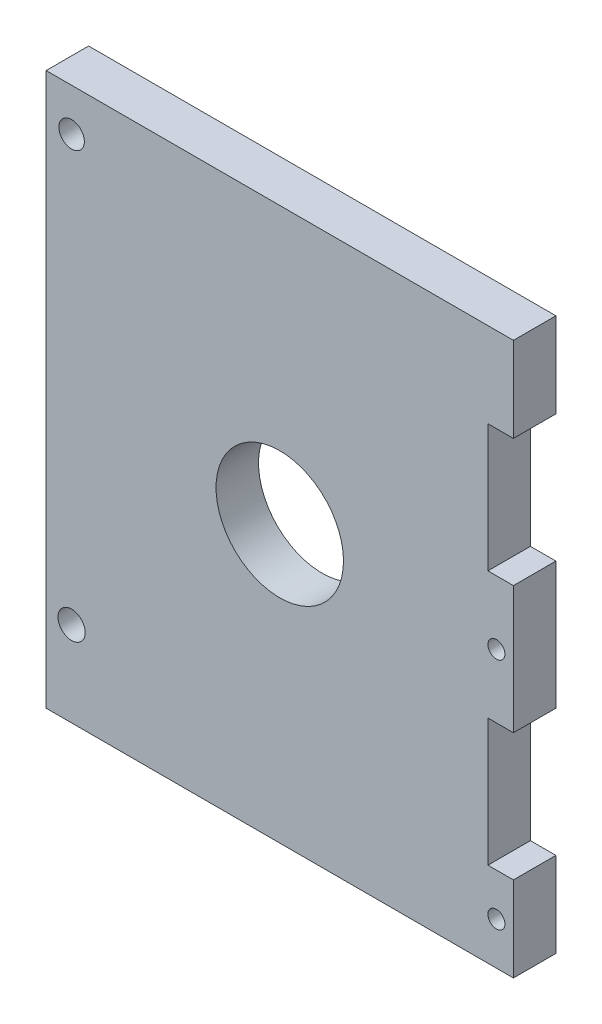
ISO-10303-21;
HEADER;
FILE_DESCRIPTION(('STEP AP214'),'2;1');
FILE_NAME('part.step','',(''),(''),'','','');
FILE_SCHEMA(('AUTOMOTIVE_DESIGN { 1 0 10303 214 1 1 1 1 }'));
ENDSEC;
DATA;
#1=APPLICATION_CONTEXT('core data for automotive mechanical design processes');
#2=APPLICATION_PROTOCOL_DEFINITION('international standard','automotive_design',2000,#1);
#3=PRODUCT_CONTEXT('',#1,'mechanical');
#4=PRODUCT('Part','Part','',(#3));
#5=PRODUCT_RELATED_PRODUCT_CATEGORY('part','',(#4));
#6=PRODUCT_DEFINITION_FORMATION('','',#4);
#7=PRODUCT_DEFINITION_CONTEXT('part definition',#1,'design');
#8=PRODUCT_DEFINITION('design','',#6,#7);
#9=PRODUCT_DEFINITION_SHAPE('','',#8);
#10=(LENGTH_UNIT() NAMED_UNIT(*) SI_UNIT(.MILLI.,.METRE.));
#11=(NAMED_UNIT(*) PLANE_ANGLE_UNIT() SI_UNIT($,.RADIAN.));
#12=(NAMED_UNIT(*) SI_UNIT($,.STERADIAN.) SOLID_ANGLE_UNIT());
#13=UNCERTAINTY_MEASURE_WITH_UNIT(LENGTH_MEASURE(1.E-05),#10,'distance_accuracy_value','');
#14=(GEOMETRIC_REPRESENTATION_CONTEXT(3) GLOBAL_UNCERTAINTY_ASSIGNED_CONTEXT((#13)) GLOBAL_UNIT_ASSIGNED_CONTEXT((#10,
#11,#12)) REPRESENTATION_CONTEXT('',''));
#15=CARTESIAN_POINT('',(0.,0.,0.));
#16=DIRECTION('',(0.,0.,1.));
#17=DIRECTION('',(1.,0.,0.));
#18=AXIS2_PLACEMENT_3D('',#15,#16,#17);
#19=CARTESIAN_POINT('',(55.,0.,5.));
#20=DIRECTION('',(-1.,0.,0.));
#21=DIRECTION('',(0.,0.,1.));
#22=AXIS2_PLACEMENT_3D('',#19,#20,#21);
#23=PLANE('',#22);
#24=DIRECTION('',(0.,1.,0.));
#25=VECTOR('',#24,1.);
#26=CARTESIAN_POINT('',(55.,0.,0.));
#27=LINE('',#26,#25);
#28=CARTESIAN_POINT('',(55.,25.,0.));
#29=VERTEX_POINT('',#28);
#30=CARTESIAN_POINT('',(55.,40.,0.));
#31=VERTEX_POINT('',#30);
#32=EDGE_CURVE('E167',#29,#31,#27,.T.);
#33=ORIENTED_EDGE('',*,*,#32,.T.);
#34=DIRECTION('',(0.,0.,1.));
#35=VECTOR('',#34,1.);
#36=CARTESIAN_POINT('',(55.,40.,0.));
#37=LINE('',#36,#35);
#38=CARTESIAN_POINT('',(55.,40.,5.));
#39=VERTEX_POINT('',#38);
#40=EDGE_CURVE('E252',#31,#39,#37,.T.);
#41=ORIENTED_EDGE('',*,*,#40,.T.);
#42=DIRECTION('',(0.,1.,0.));
#43=VECTOR('',#42,1.);
#44=CARTESIAN_POINT('',(55.,0.,5.));
#45=LINE('',#44,#43);
#46=CARTESIAN_POINT('',(55.,25.,5.));
#47=VERTEX_POINT('',#46);
#48=EDGE_CURVE('E247',#47,#39,#45,.T.);
#49=ORIENTED_EDGE('',*,*,#48,.F.);
#50=DIRECTION('',(0.,0.,1.));
#51=VECTOR('',#50,1.);
#52=CARTESIAN_POINT('',(55.,25.,0.));
#53=LINE('',#52,#51);
#54=EDGE_CURVE('E212',#29,#47,#53,.T.);
#55=ORIENTED_EDGE('',*,*,#54,.F.);
#56=EDGE_LOOP('',(#33,#41,#49,#55));
#57=FACE_BOUND('',#56,.T.);
#58=ADVANCED_FACE('F50',(#57),#23,.F.);
#59=CARTESIAN_POINT('',(55.,0.,0.));
#60=VERTEX_POINT('',#59);
#61=CARTESIAN_POINT('',(55.,10.,0.));
#62=VERTEX_POINT('',#61);
#63=EDGE_CURVE('E170',#60,#62,#27,.T.);
#64=ORIENTED_EDGE('',*,*,#63,.T.);
#65=DIRECTION('',(0.,0.,1.));
#66=VECTOR('',#65,1.);
#67=CARTESIAN_POINT('',(55.,10.,0.));
#68=LINE('',#67,#66);
#69=CARTESIAN_POINT('',(55.,10.,5.));
#70=VERTEX_POINT('',#69);
#71=EDGE_CURVE('E234',#62,#70,#68,.T.);
#72=ORIENTED_EDGE('',*,*,#71,.T.);
#73=CARTESIAN_POINT('',(55.,0.,5.));
#74=VERTEX_POINT('',#73);
#75=EDGE_CURVE('E204',#74,#70,#45,.T.);
#76=ORIENTED_EDGE('',*,*,#75,.F.);
#77=DIRECTION('',(0.,0.,-1.));
#78=VECTOR('',#77,1.);
#79=CARTESIAN_POINT('',(55.,0.,5.));
#80=LINE('',#79,#78);
#81=EDGE_CURVE('E59',#74,#60,#80,.T.);
#82=ORIENTED_EDGE('',*,*,#81,.T.);
#83=EDGE_LOOP('',(#64,#72,#76,#82));
#84=FACE_BOUND('',#83,.T.);
#85=ADVANCED_FACE('F202',(#84),#23,.F.);
#86=CARTESIAN_POINT('',(0.,0.,5.));
#87=DIRECTION('',(1.,0.,0.));
#88=DIRECTION('',(0.,0.,-1.));
#89=AXIS2_PLACEMENT_3D('',#86,#87,#88);
#90=PLANE('',#89);
#91=DIRECTION('',(0.,-1.,0.));
#92=VECTOR('',#91,1.);
#93=CARTESIAN_POINT('',(0.,0.,0.));
#94=LINE('',#93,#92);
#95=CARTESIAN_POINT('',(0.,65.,0.));
#96=VERTEX_POINT('',#95);
#97=CARTESIAN_POINT('',(0.,0.,0.));
#98=VERTEX_POINT('',#97);
#99=EDGE_CURVE('E174',#96,#98,#94,.T.);
#100=ORIENTED_EDGE('',*,*,#99,.T.);
#101=DIRECTION('',(0.,0.,-1.));
#102=VECTOR('',#101,1.);
#103=CARTESIAN_POINT('',(0.,0.,5.));
#104=LINE('',#103,#102);
#105=CARTESIAN_POINT('',(0.,0.,5.));
#106=VERTEX_POINT('',#105);
#107=EDGE_CURVE('E13',#106,#98,#104,.T.);
#108=ORIENTED_EDGE('',*,*,#107,.F.);
#109=DIRECTION('',(0.,-1.,0.));
#110=VECTOR('',#109,1.);
#111=CARTESIAN_POINT('',(0.,0.,5.));
#112=LINE('',#111,#110);
#113=CARTESIAN_POINT('',(0.,65.,5.));
#114=VERTEX_POINT('',#113);
#115=EDGE_CURVE('E184',#114,#106,#112,.T.);
#116=ORIENTED_EDGE('',*,*,#115,.F.);
#117=DIRECTION('',(0.,0.,-1.));
#118=VECTOR('',#117,1.);
#119=CARTESIAN_POINT('',(0.,65.,5.));
#120=LINE('',#119,#118);
#121=EDGE_CURVE('E193',#114,#96,#120,.T.);
#122=ORIENTED_EDGE('',*,*,#121,.T.);
#123=EDGE_LOOP('',(#100,#108,#116,#122));
#124=FACE_BOUND('',#123,.T.);
#125=ADVANCED_FACE('F52',(#124),#90,.F.);
#126=CARTESIAN_POINT('',(0.,0.,5.));
#127=DIRECTION('',(0.,1.,0.));
#128=DIRECTION('',(0.,0.,1.));
#129=AXIS2_PLACEMENT_3D('',#126,#127,#128);
#130=PLANE('',#129);
#131=DIRECTION('',(1.,0.,0.));
#132=VECTOR('',#131,1.);
#133=CARTESIAN_POINT('',(0.,0.,0.));
#134=LINE('',#133,#132);
#135=EDGE_CURVE('E168',#98,#60,#134,.T.);
#136=ORIENTED_EDGE('',*,*,#135,.T.);
#137=ORIENTED_EDGE('',*,*,#81,.F.);
#138=DIRECTION('',(1.,0.,0.));
#139=VECTOR('',#138,1.);
#140=CARTESIAN_POINT('',(0.,0.,5.));
#141=LINE('',#140,#139);
#142=EDGE_CURVE('E190',#106,#74,#141,.T.);
#143=ORIENTED_EDGE('',*,*,#142,.F.);
#144=ORIENTED_EDGE('',*,*,#107,.T.);
#145=EDGE_LOOP('',(#136,#137,#143,#144));
#146=FACE_BOUND('',#145,.T.);
#147=ADVANCED_FACE('F284',(#146),#130,.F.);
#148=CARTESIAN_POINT('',(55.,55.,5.));
#149=VERTEX_POINT('',#148);
#150=CARTESIAN_POINT('',(55.,65.,5.));
#151=VERTEX_POINT('',#150);
#152=EDGE_CURVE('E157',#149,#151,#45,.T.);
#153=ORIENTED_EDGE('',*,*,#152,.F.);
#154=DIRECTION('',(0.,0.,1.));
#155=VECTOR('',#154,1.);
#156=CARTESIAN_POINT('',(55.,55.,0.));
#157=LINE('',#156,#155);
#158=CARTESIAN_POINT('',(55.,55.,0.));
#159=VERTEX_POINT('',#158);
#160=EDGE_CURVE('E143',#159,#149,#157,.T.);
#161=ORIENTED_EDGE('',*,*,#160,.F.);
#162=CARTESIAN_POINT('',(55.,65.,0.));
#163=VERTEX_POINT('',#162);
#164=EDGE_CURVE('E155',#159,#163,#27,.T.);
#165=ORIENTED_EDGE('',*,*,#164,.T.);
#166=DIRECTION('',(0.,0.,-1.));
#167=VECTOR('',#166,1.);
#168=CARTESIAN_POINT('',(55.,65.,5.));
#169=LINE('',#168,#167);
#170=EDGE_CURVE('E196',#151,#163,#169,.T.);
#171=ORIENTED_EDGE('',*,*,#170,.F.);
#172=EDGE_LOOP('',(#153,#161,#165,#171));
#173=FACE_BOUND('',#172,.T.);
#174=ADVANCED_FACE('F153',(#173),#23,.F.);
#175=CARTESIAN_POINT('',(0.,65.,5.));
#176=DIRECTION('',(0.,-1.,0.));
#177=DIRECTION('',(0.,0.,-1.));
#178=AXIS2_PLACEMENT_3D('',#175,#176,#177);
#179=PLANE('',#178);
#180=DIRECTION('',(-1.,0.,0.));
#181=VECTOR('',#180,1.);
#182=CARTESIAN_POINT('',(0.,65.,0.));
#183=LINE('',#182,#181);
#184=EDGE_CURVE('E165',#163,#96,#183,.T.);
#185=ORIENTED_EDGE('',*,*,#184,.T.);
#186=ORIENTED_EDGE('',*,*,#121,.F.);
#187=DIRECTION('',(-1.,0.,0.));
#188=VECTOR('',#187,1.);
#189=CARTESIAN_POINT('',(0.,65.,5.));
#190=LINE('',#189,#188);
#191=EDGE_CURVE('E197',#151,#114,#190,.T.);
#192=ORIENTED_EDGE('',*,*,#191,.F.);
#193=ORIENTED_EDGE('',*,*,#170,.T.);
#194=EDGE_LOOP('',(#185,#186,#192,#193));
#195=FACE_BOUND('',#194,.T.);
#196=ADVANCED_FACE('F281',(#195),#179,.F.);
#197=CARTESIAN_POINT('',(0.,0.,5.));
#198=DIRECTION('',(0.,0.,-1.));
#199=DIRECTION('',(-1.,0.,0.));
#200=AXIS2_PLACEMENT_3D('',#197,#198,#199);
#201=PLANE('',#200);
#202=CARTESIAN_POINT('',(53.,32.5,5.));
#203=DIRECTION('',(0.,0.,-1.));
#204=DIRECTION('',(-1.,0.,0.));
#205=AXIS2_PLACEMENT_3D('',#202,#203,#204);
#206=CIRCLE('',#205,0.999999999999998);
#207=CARTESIAN_POINT('',(52.,32.5,5.));
#208=VERTEX_POINT('',#207);
#209=EDGE_CURVE('E345',#208,#208,#206,.T.);
#210=ORIENTED_EDGE('',*,*,#209,.T.);
#211=EDGE_LOOP('',(#210));
#212=FACE_BOUND('',#211,.T.);
#213=CARTESIAN_POINT('',(53.,5.,5.));
#214=DIRECTION('',(0.,0.,-1.));
#215=DIRECTION('',(-1.,0.,0.));
#216=AXIS2_PLACEMENT_3D('',#213,#214,#215);
#217=CIRCLE('',#216,0.999999999999998);
#218=CARTESIAN_POINT('',(52.,5.,5.));
#219=VERTEX_POINT('',#218);
#220=EDGE_CURVE('E350',#219,#219,#217,.T.);
#221=ORIENTED_EDGE('',*,*,#220,.T.);
#222=EDGE_LOOP('',(#221));
#223=FACE_BOUND('',#222,.T.);
#224=CARTESIAN_POINT('',(3.,60.,5.));
#225=DIRECTION('',(0.,0.,1.));
#226=DIRECTION('',(1.,0.,0.));
#227=AXIS2_PLACEMENT_3D('',#224,#225,#226);
#228=CIRCLE('',#227,1.5);
#229=CARTESIAN_POINT('',(4.5,60.,5.));
#230=VERTEX_POINT('',#229);
#231=EDGE_CURVE('E368',#230,#230,#228,.T.);
#232=ORIENTED_EDGE('',*,*,#231,.F.);
#233=EDGE_LOOP('',(#232));
#234=FACE_BOUND('',#233,.T.);
#235=CARTESIAN_POINT('',(3.,10.,5.));
#236=DIRECTION('',(0.,0.,1.));
#237=DIRECTION('',(1.,0.,0.));
#238=AXIS2_PLACEMENT_3D('',#235,#236,#237);
#239=CIRCLE('',#238,1.6);
#240=CARTESIAN_POINT('',(4.6,10.,5.));
#241=VERTEX_POINT('',#240);
#242=EDGE_CURVE('E354',#241,#241,#239,.T.);
#243=ORIENTED_EDGE('',*,*,#242,.F.);
#244=EDGE_LOOP('',(#243));
#245=FACE_BOUND('',#244,.T.);
#246=CARTESIAN_POINT('',(27.5,32.5,5.));
#247=DIRECTION('',(0.,0.,1.));
#248=DIRECTION('',(1.,0.,0.));
#249=AXIS2_PLACEMENT_3D('',#246,#247,#248);
#250=CIRCLE('',#249,7.5);
#251=CARTESIAN_POINT('',(35.,32.5,5.));
#252=VERTEX_POINT('',#251);
#253=EDGE_CURVE('E367',#252,#252,#250,.T.);
#254=ORIENTED_EDGE('',*,*,#253,.F.);
#255=EDGE_LOOP('',(#254));
#256=FACE_BOUND('',#255,.T.);
#257=ORIENTED_EDGE('',*,*,#48,.T.);
#258=DIRECTION('',(1.,0.,0.));
#259=VECTOR('',#258,1.);
#260=CARTESIAN_POINT('',(55.,40.,5.));
#261=LINE('',#260,#259);
#262=CARTESIAN_POINT('',(52.,40.,5.));
#263=VERTEX_POINT('',#262);
#264=EDGE_CURVE('E149',#263,#39,#261,.T.);
#265=ORIENTED_EDGE('',*,*,#264,.F.);
#266=DIRECTION('',(0.,-1.,0.));
#267=VECTOR('',#266,1.);
#268=CARTESIAN_POINT('',(52.,55.,5.));
#269=LINE('',#268,#267);
#270=CARTESIAN_POINT('',(52.,55.,5.));
#271=VERTEX_POINT('',#270);
#272=EDGE_CURVE('E390',#271,#263,#269,.T.);
#273=ORIENTED_EDGE('',*,*,#272,.F.);
#274=DIRECTION('',(-1.,0.,0.));
#275=VECTOR('',#274,1.);
#276=CARTESIAN_POINT('',(55.,55.,5.));
#277=LINE('',#276,#275);
#278=EDGE_CURVE('E237',#149,#271,#277,.T.);
#279=ORIENTED_EDGE('',*,*,#278,.F.);
#280=ORIENTED_EDGE('',*,*,#152,.T.);
#281=ORIENTED_EDGE('',*,*,#191,.T.);
#282=ORIENTED_EDGE('',*,*,#115,.T.);
#283=ORIENTED_EDGE('',*,*,#142,.T.);
#284=ORIENTED_EDGE('',*,*,#75,.T.);
#285=DIRECTION('',(1.,0.,0.));
#286=VECTOR('',#285,1.);
#287=CARTESIAN_POINT('',(55.,10.,5.));
#288=LINE('',#287,#286);
#289=CARTESIAN_POINT('',(52.,10.,5.));
#290=VERTEX_POINT('',#289);
#291=EDGE_CURVE('E231',#290,#70,#288,.T.);
#292=ORIENTED_EDGE('',*,*,#291,.F.);
#293=DIRECTION('',(0.,-1.,0.));
#294=VECTOR('',#293,1.);
#295=CARTESIAN_POINT('',(52.,25.,5.));
#296=LINE('',#295,#294);
#297=CARTESIAN_POINT('',(52.,25.,5.));
#298=VERTEX_POINT('',#297);
#299=EDGE_CURVE('E226',#298,#290,#296,.T.);
#300=ORIENTED_EDGE('',*,*,#299,.F.);
#301=DIRECTION('',(-1.,0.,0.));
#302=VECTOR('',#301,1.);
#303=CARTESIAN_POINT('',(55.,25.,5.));
#304=LINE('',#303,#302);
#305=EDGE_CURVE('E222',#47,#298,#304,.T.);
#306=ORIENTED_EDGE('',*,*,#305,.F.);
#307=EDGE_LOOP('',(#257,#265,#273,#279,#280,#281,#282,#283,#284,#292,#300,#306));
#308=FACE_BOUND('',#307,.T.);
#309=ADVANCED_FACE('F278',(#212,#223,#234,#245,#256,#308),#201,.F.);
#310=CARTESIAN_POINT('',(0.,0.,0.));
#311=DIRECTION('',(0.,0.,-1.));
#312=DIRECTION('',(-1.,0.,0.));
#313=AXIS2_PLACEMENT_3D('',#310,#311,#312);
#314=PLANE('',#313);
#315=CARTESIAN_POINT('',(53.,32.5,0.));
#316=DIRECTION('',(0.,0.,-1.));
#317=DIRECTION('',(-1.,0.,0.));
#318=AXIS2_PLACEMENT_3D('',#315,#316,#317);
#319=CIRCLE('',#318,0.999999999999998);
#320=CARTESIAN_POINT('',(52.,32.5,0.));
#321=VERTEX_POINT('',#320);
#322=EDGE_CURVE('E348',#321,#321,#319,.T.);
#323=ORIENTED_EDGE('',*,*,#322,.F.);
#324=EDGE_LOOP('',(#323));
#325=FACE_BOUND('',#324,.T.);
#326=CARTESIAN_POINT('',(53.,5.,0.));
#327=DIRECTION('',(0.,0.,-1.));
#328=DIRECTION('',(-1.,0.,0.));
#329=AXIS2_PLACEMENT_3D('',#326,#327,#328);
#330=CIRCLE('',#329,0.999999999999998);
#331=CARTESIAN_POINT('',(52.,5.,0.));
#332=VERTEX_POINT('',#331);
#333=EDGE_CURVE('E357',#332,#332,#330,.T.);
#334=ORIENTED_EDGE('',*,*,#333,.F.);
#335=EDGE_LOOP('',(#334));
#336=FACE_BOUND('',#335,.T.);
#337=CARTESIAN_POINT('',(3.,60.,0.));
#338=DIRECTION('',(0.,0.,1.));
#339=DIRECTION('',(1.,0.,0.));
#340=AXIS2_PLACEMENT_3D('',#337,#338,#339);
#341=CIRCLE('',#340,1.5);
#342=CARTESIAN_POINT('',(4.5,60.,0.));
#343=VERTEX_POINT('',#342);
#344=EDGE_CURVE('E363',#343,#343,#341,.T.);
#345=ORIENTED_EDGE('',*,*,#344,.T.);
#346=EDGE_LOOP('',(#345));
#347=FACE_BOUND('',#346,.T.);
#348=CARTESIAN_POINT('',(3.,10.,0.));
#349=DIRECTION('',(0.,0.,1.));
#350=DIRECTION('',(1.,0.,0.));
#351=AXIS2_PLACEMENT_3D('',#348,#349,#350);
#352=CIRCLE('',#351,1.6);
#353=CARTESIAN_POINT('',(4.6,10.,0.));
#354=VERTEX_POINT('',#353);
#355=EDGE_CURVE('E372',#354,#354,#352,.T.);
#356=ORIENTED_EDGE('',*,*,#355,.T.);
#357=EDGE_LOOP('',(#356));
#358=FACE_BOUND('',#357,.T.);
#359=CARTESIAN_POINT('',(27.5,32.5,0.));
#360=DIRECTION('',(0.,0.,1.));
#361=DIRECTION('',(1.,0.,0.));
#362=AXIS2_PLACEMENT_3D('',#359,#360,#361);
#363=CIRCLE('',#362,7.5);
#364=CARTESIAN_POINT('',(35.,32.5,0.));
#365=VERTEX_POINT('',#364);
#366=EDGE_CURVE('E227',#365,#365,#363,.T.);
#367=ORIENTED_EDGE('',*,*,#366,.T.);
#368=EDGE_LOOP('',(#367));
#369=FACE_BOUND('',#368,.T.);
#370=DIRECTION('',(1.,0.,0.));
#371=VECTOR('',#370,1.);
#372=CARTESIAN_POINT('',(55.,40.,0.));
#373=LINE('',#372,#371);
#374=CARTESIAN_POINT('',(52.,40.,0.));
#375=VERTEX_POINT('',#374);
#376=EDGE_CURVE('E159',#375,#31,#373,.T.);
#377=ORIENTED_EDGE('',*,*,#376,.T.);
#378=ORIENTED_EDGE('',*,*,#32,.F.);
#379=DIRECTION('',(-1.,0.,0.));
#380=VECTOR('',#379,1.);
#381=CARTESIAN_POINT('',(55.,25.,0.));
#382=LINE('',#381,#380);
#383=CARTESIAN_POINT('',(52.,25.,0.));
#384=VERTEX_POINT('',#383);
#385=EDGE_CURVE('E218',#29,#384,#382,.T.);
#386=ORIENTED_EDGE('',*,*,#385,.T.);
#387=DIRECTION('',(0.,-1.,0.));
#388=VECTOR('',#387,1.);
#389=CARTESIAN_POINT('',(52.,25.,0.));
#390=LINE('',#389,#388);
#391=CARTESIAN_POINT('',(52.,10.,0.));
#392=VERTEX_POINT('',#391);
#393=EDGE_CURVE('E74',#384,#392,#390,.T.);
#394=ORIENTED_EDGE('',*,*,#393,.T.);
#395=DIRECTION('',(1.,0.,0.));
#396=VECTOR('',#395,1.);
#397=CARTESIAN_POINT('',(55.,10.,0.));
#398=LINE('',#397,#396);
#399=EDGE_CURVE('E208',#392,#62,#398,.T.);
#400=ORIENTED_EDGE('',*,*,#399,.T.);
#401=ORIENTED_EDGE('',*,*,#63,.F.);
#402=ORIENTED_EDGE('',*,*,#135,.F.);
#403=ORIENTED_EDGE('',*,*,#99,.F.);
#404=ORIENTED_EDGE('',*,*,#184,.F.);
#405=ORIENTED_EDGE('',*,*,#164,.F.);
#406=DIRECTION('',(-1.,0.,0.));
#407=VECTOR('',#406,1.);
#408=CARTESIAN_POINT('',(55.,55.,0.));
#409=LINE('',#408,#407);
#410=CARTESIAN_POINT('',(52.,55.,0.));
#411=VERTEX_POINT('',#410);
#412=EDGE_CURVE('E139',#159,#411,#409,.T.);
#413=ORIENTED_EDGE('',*,*,#412,.T.);
#414=DIRECTION('',(0.,-1.,0.));
#415=VECTOR('',#414,1.);
#416=CARTESIAN_POINT('',(52.,55.,0.));
#417=LINE('',#416,#415);
#418=EDGE_CURVE('E66',#411,#375,#417,.T.);
#419=ORIENTED_EDGE('',*,*,#418,.T.);
#420=EDGE_LOOP('',(#377,#378,#386,#394,#400,#401,#402,#403,#404,#405,#413,#419));
#421=FACE_BOUND('',#420,.T.);
#422=ADVANCED_FACE('F163',(#325,#336,#347,#358,#369,#421),#314,.T.);
#423=CARTESIAN_POINT('',(55.,10.,0.));
#424=DIRECTION('',(0.,-1.,0.));
#425=DIRECTION('',(0.,0.,-1.));
#426=AXIS2_PLACEMENT_3D('',#423,#424,#425);
#427=PLANE('',#426);
#428=ORIENTED_EDGE('',*,*,#291,.T.);
#429=ORIENTED_EDGE('',*,*,#71,.F.);
#430=ORIENTED_EDGE('',*,*,#399,.F.);
#431=DIRECTION('',(0.,0.,1.));
#432=VECTOR('',#431,1.);
#433=CARTESIAN_POINT('',(52.,10.,0.));
#434=LINE('',#433,#432);
#435=EDGE_CURVE('E238',#392,#290,#434,.T.);
#436=ORIENTED_EDGE('',*,*,#435,.T.);
#437=EDGE_LOOP('',(#428,#429,#430,#436));
#438=FACE_BOUND('',#437,.T.);
#439=ADVANCED_FACE('F300',(#438),#427,.F.);
#440=CARTESIAN_POINT('',(52.,25.,0.));
#441=DIRECTION('',(-1.,0.,0.));
#442=DIRECTION('',(0.,0.,1.));
#443=AXIS2_PLACEMENT_3D('',#440,#441,#442);
#444=PLANE('',#443);
#445=ORIENTED_EDGE('',*,*,#299,.T.);
#446=ORIENTED_EDGE('',*,*,#435,.F.);
#447=ORIENTED_EDGE('',*,*,#393,.F.);
#448=DIRECTION('',(0.,0.,1.));
#449=VECTOR('',#448,1.);
#450=CARTESIAN_POINT('',(52.,25.,0.));
#451=LINE('',#450,#449);
#452=EDGE_CURVE('E216',#384,#298,#451,.T.);
#453=ORIENTED_EDGE('',*,*,#452,.T.);
#454=EDGE_LOOP('',(#445,#446,#447,#453));
#455=FACE_BOUND('',#454,.T.);
#456=ADVANCED_FACE('F308',(#455),#444,.F.);
#457=CARTESIAN_POINT('',(55.,25.,0.));
#458=DIRECTION('',(0.,1.,0.));
#459=DIRECTION('',(0.,0.,1.));
#460=AXIS2_PLACEMENT_3D('',#457,#458,#459);
#461=PLANE('',#460);
#462=ORIENTED_EDGE('',*,*,#305,.T.);
#463=ORIENTED_EDGE('',*,*,#452,.F.);
#464=ORIENTED_EDGE('',*,*,#385,.F.);
#465=ORIENTED_EDGE('',*,*,#54,.T.);
#466=EDGE_LOOP('',(#462,#463,#464,#465));
#467=FACE_BOUND('',#466,.T.);
#468=ADVANCED_FACE('F272',(#467),#461,.F.);
#469=CARTESIAN_POINT('',(55.,40.,0.));
#470=DIRECTION('',(0.,-1.,0.));
#471=DIRECTION('',(0.,0.,-1.));
#472=AXIS2_PLACEMENT_3D('',#469,#470,#471);
#473=PLANE('',#472);
#474=ORIENTED_EDGE('',*,*,#264,.T.);
#475=ORIENTED_EDGE('',*,*,#40,.F.);
#476=ORIENTED_EDGE('',*,*,#376,.F.);
#477=DIRECTION('',(0.,0.,1.));
#478=VECTOR('',#477,1.);
#479=CARTESIAN_POINT('',(52.,40.,0.));
#480=LINE('',#479,#478);
#481=EDGE_CURVE('E257',#375,#263,#480,.T.);
#482=ORIENTED_EDGE('',*,*,#481,.T.);
#483=EDGE_LOOP('',(#474,#475,#476,#482));
#484=FACE_BOUND('',#483,.T.);
#485=ADVANCED_FACE('F307',(#484),#473,.F.);
#486=CARTESIAN_POINT('',(52.,55.,0.));
#487=DIRECTION('',(-1.,0.,0.));
#488=DIRECTION('',(0.,0.,1.));
#489=AXIS2_PLACEMENT_3D('',#486,#487,#488);
#490=PLANE('',#489);
#491=ORIENTED_EDGE('',*,*,#272,.T.);
#492=ORIENTED_EDGE('',*,*,#481,.F.);
#493=ORIENTED_EDGE('',*,*,#418,.F.);
#494=DIRECTION('',(0.,0.,1.));
#495=VECTOR('',#494,1.);
#496=CARTESIAN_POINT('',(52.,55.,0.));
#497=LINE('',#496,#495);
#498=EDGE_CURVE('E145',#411,#271,#497,.T.);
#499=ORIENTED_EDGE('',*,*,#498,.T.);
#500=EDGE_LOOP('',(#491,#492,#493,#499));
#501=FACE_BOUND('',#500,.T.);
#502=ADVANCED_FACE('F316',(#501),#490,.F.);
#503=CARTESIAN_POINT('',(55.,55.,0.));
#504=DIRECTION('',(0.,1.,0.));
#505=DIRECTION('',(0.,0.,1.));
#506=AXIS2_PLACEMENT_3D('',#503,#504,#505);
#507=PLANE('',#506);
#508=ORIENTED_EDGE('',*,*,#278,.T.);
#509=ORIENTED_EDGE('',*,*,#498,.F.);
#510=ORIENTED_EDGE('',*,*,#412,.F.);
#511=ORIENTED_EDGE('',*,*,#160,.T.);
#512=EDGE_LOOP('',(#508,#509,#510,#511));
#513=FACE_BOUND('',#512,.T.);
#514=ADVANCED_FACE('F142',(#513),#507,.F.);
#515=CARTESIAN_POINT('',(27.5,32.5,0.));
#516=DIRECTION('',(0.,0.,1.));
#517=DIRECTION('',(1.,0.,0.));
#518=AXIS2_PLACEMENT_3D('',#515,#516,#517);
#519=CYLINDRICAL_SURFACE('',#518,7.5);
#520=ORIENTED_EDGE('',*,*,#366,.F.);
#521=EDGE_LOOP('',(#520));
#522=FACE_BOUND('',#521,.T.);
#523=ORIENTED_EDGE('',*,*,#253,.T.);
#524=EDGE_LOOP('',(#523));
#525=FACE_BOUND('',#524,.T.);
#526=ADVANCED_FACE('F315',(#522,#525),#519,.F.);
#527=CARTESIAN_POINT('',(3.,10.,0.));
#528=DIRECTION('',(0.,0.,1.));
#529=DIRECTION('',(1.,0.,0.));
#530=AXIS2_PLACEMENT_3D('',#527,#528,#529);
#531=CYLINDRICAL_SURFACE('',#530,1.6);
#532=ORIENTED_EDGE('',*,*,#355,.F.);
#533=EDGE_LOOP('',(#532));
#534=FACE_BOUND('',#533,.T.);
#535=ORIENTED_EDGE('',*,*,#242,.T.);
#536=EDGE_LOOP('',(#535));
#537=FACE_BOUND('',#536,.T.);
#538=ADVANCED_FACE('F324',(#534,#537),#531,.F.);
#539=CARTESIAN_POINT('',(3.,60.,0.));
#540=DIRECTION('',(0.,0.,1.));
#541=DIRECTION('',(1.,0.,0.));
#542=AXIS2_PLACEMENT_3D('',#539,#540,#541);
#543=CYLINDRICAL_SURFACE('',#542,1.5);
#544=ORIENTED_EDGE('',*,*,#344,.F.);
#545=EDGE_LOOP('',(#544));
#546=FACE_BOUND('',#545,.T.);
#547=ORIENTED_EDGE('',*,*,#231,.T.);
#548=EDGE_LOOP('',(#547));
#549=FACE_BOUND('',#548,.T.);
#550=ADVANCED_FACE('F328',(#546,#549),#543,.F.);
#551=CARTESIAN_POINT('',(53.,5.,5.));
#552=DIRECTION('',(0.,0.,-1.));
#553=DIRECTION('',(-1.,0.,0.));
#554=AXIS2_PLACEMENT_3D('',#551,#552,#553);
#555=CYLINDRICAL_SURFACE('',#554,0.999999999999998);
#556=ORIENTED_EDGE('',*,*,#220,.F.);
#557=EDGE_LOOP('',(#556));
#558=FACE_BOUND('',#557,.T.);
#559=ORIENTED_EDGE('',*,*,#333,.T.);
#560=EDGE_LOOP('',(#559));
#561=FACE_BOUND('',#560,.T.);
#562=ADVANCED_FACE('F332',(#558,#561),#555,.F.);
#563=CARTESIAN_POINT('',(53.,32.5,5.));
#564=DIRECTION('',(0.,0.,-1.));
#565=DIRECTION('',(-1.,0.,0.));
#566=AXIS2_PLACEMENT_3D('',#563,#564,#565);
#567=CYLINDRICAL_SURFACE('',#566,0.999999999999998);
#568=ORIENTED_EDGE('',*,*,#209,.F.);
#569=EDGE_LOOP('',(#568));
#570=FACE_BOUND('',#569,.T.);
#571=ORIENTED_EDGE('',*,*,#322,.T.);
#572=EDGE_LOOP('',(#571));
#573=FACE_BOUND('',#572,.T.);
#574=ADVANCED_FACE('F336',(#570,#573),#567,.F.);
#575=CLOSED_SHELL('',(#58,#85,#125,#147,#174,#196,#309,#422,#439,#456,#468,#485,#502,#514,#526,
#538,#550,#562,#574));
#576=MANIFOLD_SOLID_BREP('B2',#575);
#577=ADVANCED_BREP_SHAPE_REPRESENTATION('',(#18,#576),#14);
#578=SHAPE_DEFINITION_REPRESENTATION(#9,#577);
ENDSEC;
END-ISO-10303-21;
